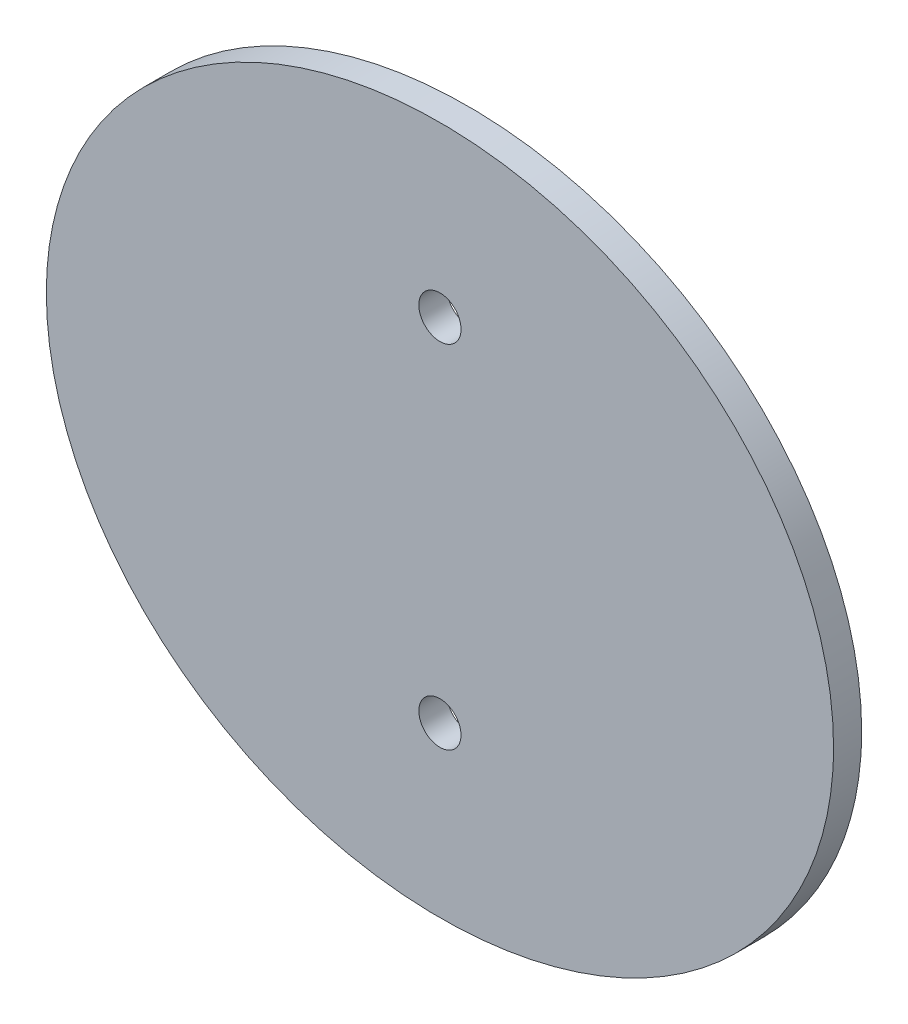
ISO-10303-21;
HEADER;
FILE_DESCRIPTION(('STEP AP214'),'2;1');
FILE_NAME('part.step','',(''),(''),'','','');
FILE_SCHEMA(('AUTOMOTIVE_DESIGN { 1 0 10303 214 1 1 1 1 }'));
ENDSEC;
DATA;
#1=APPLICATION_CONTEXT('core data for automotive mechanical design processes');
#2=APPLICATION_PROTOCOL_DEFINITION('international standard','automotive_design',2000,#1);
#3=PRODUCT_CONTEXT('',#1,'mechanical');
#4=PRODUCT('Part','Part','',(#3));
#5=PRODUCT_RELATED_PRODUCT_CATEGORY('part','',(#4));
#6=PRODUCT_DEFINITION_FORMATION('','',#4);
#7=PRODUCT_DEFINITION_CONTEXT('part definition',#1,'design');
#8=PRODUCT_DEFINITION('design','',#6,#7);
#9=PRODUCT_DEFINITION_SHAPE('','',#8);
#10=(LENGTH_UNIT() NAMED_UNIT(*) SI_UNIT(.MILLI.,.METRE.));
#11=(NAMED_UNIT(*) PLANE_ANGLE_UNIT() SI_UNIT($,.RADIAN.));
#12=(NAMED_UNIT(*) SI_UNIT($,.STERADIAN.) SOLID_ANGLE_UNIT());
#13=UNCERTAINTY_MEASURE_WITH_UNIT(LENGTH_MEASURE(1.E-05),#10,'distance_accuracy_value','');
#14=(GEOMETRIC_REPRESENTATION_CONTEXT(3) GLOBAL_UNCERTAINTY_ASSIGNED_CONTEXT((#13)) GLOBAL_UNIT_ASSIGNED_CONTEXT((#10,
#11,#12)) REPRESENTATION_CONTEXT('',''));
#15=CARTESIAN_POINT('',(0.,0.,0.));
#16=DIRECTION('',(0.,0.,1.));
#17=DIRECTION('',(1.,0.,0.));
#18=AXIS2_PLACEMENT_3D('',#15,#16,#17);
#19=CARTESIAN_POINT('',(0.,0.,2.));
#20=DIRECTION('',(0.,0.,1.));
#21=DIRECTION('',(1.,0.,0.));
#22=AXIS2_PLACEMENT_3D('',#19,#20,#21);
#23=PLANE('',#22);
#24=CARTESIAN_POINT('',(0.,-12.5,2.));
#25=DIRECTION('',(0.,0.,1.));
#26=DIRECTION('',(1.,0.,0.));
#27=AXIS2_PLACEMENT_3D('',#24,#25,#26);
#28=CIRCLE('',#27,1.5);
#29=CARTESIAN_POINT('',(1.49999999999998,-12.5,2.));
#30=VERTEX_POINT('',#29);
#31=EDGE_CURVE('E37',#30,#30,#28,.T.);
#32=ORIENTED_EDGE('',*,*,#31,.F.);
#33=EDGE_LOOP('',(#32));
#34=FACE_BOUND('',#33,.T.);
#35=CARTESIAN_POINT('',(0.,0.,2.));
#36=DIRECTION('',(0.,0.,1.));
#37=DIRECTION('',(1.,0.,0.));
#38=AXIS2_PLACEMENT_3D('',#35,#36,#37);
#39=ELLIPSE('',#38,28.,24.5);
#40=CARTESIAN_POINT('',(28.,0.,2.));
#41=VERTEX_POINT('',#40);
#42=EDGE_CURVE('E10',#41,#41,#39,.T.);
#43=ORIENTED_EDGE('',*,*,#42,.T.);
#44=EDGE_LOOP('',(#43));
#45=FACE_BOUND('',#44,.T.);
#46=CARTESIAN_POINT('',(0.,12.5,2.));
#47=DIRECTION('',(0.,0.,1.));
#48=DIRECTION('',(1.,0.,0.));
#49=AXIS2_PLACEMENT_3D('',#46,#47,#48);
#50=CIRCLE('',#49,1.5);
#51=CARTESIAN_POINT('',(1.5,12.5,2.));
#52=VERTEX_POINT('',#51);
#53=EDGE_CURVE('E43',#52,#52,#50,.T.);
#54=ORIENTED_EDGE('',*,*,#53,.F.);
#55=EDGE_LOOP('',(#54));
#56=FACE_BOUND('',#55,.T.);
#57=ADVANCED_FACE('F26',(#34,#45,#56),#23,.T.);
#58=CARTESIAN_POINT('',(0.,0.,0.));
#59=DIRECTION('',(0.,0.,1.));
#60=DIRECTION('',(1.,0.,0.));
#61=AXIS2_PLACEMENT_3D('',#58,#59,#60);
#62=PLANE('',#61);
#63=CARTESIAN_POINT('',(0.,0.,0.));
#64=DIRECTION('',(0.,0.,1.));
#65=DIRECTION('',(1.,0.,0.));
#66=AXIS2_PLACEMENT_3D('',#63,#64,#65);
#67=ELLIPSE('',#66,28.,24.5);
#68=CARTESIAN_POINT('',(28.,0.,0.));
#69=VERTEX_POINT('',#68);
#70=EDGE_CURVE('E31',#69,#69,#67,.T.);
#71=ORIENTED_EDGE('',*,*,#70,.F.);
#72=EDGE_LOOP('',(#71));
#73=FACE_BOUND('',#72,.T.);
#74=CARTESIAN_POINT('',(0.,-12.5,0.));
#75=DIRECTION('',(0.,0.,1.));
#76=DIRECTION('',(1.,0.,0.));
#77=AXIS2_PLACEMENT_3D('',#74,#75,#76);
#78=CIRCLE('',#77,1.5);
#79=CARTESIAN_POINT('',(1.49999999999998,-12.5,0.));
#80=VERTEX_POINT('',#79);
#81=EDGE_CURVE('E40',#80,#80,#78,.T.);
#82=ORIENTED_EDGE('',*,*,#81,.T.);
#83=EDGE_LOOP('',(#82));
#84=FACE_BOUND('',#83,.T.);
#85=CARTESIAN_POINT('',(0.,12.5,0.));
#86=DIRECTION('',(0.,0.,1.));
#87=DIRECTION('',(1.,0.,0.));
#88=AXIS2_PLACEMENT_3D('',#85,#86,#87);
#89=CIRCLE('',#88,1.5);
#90=CARTESIAN_POINT('',(1.5,12.5,0.));
#91=VERTEX_POINT('',#90);
#92=EDGE_CURVE('E46',#91,#91,#89,.T.);
#93=ORIENTED_EDGE('',*,*,#92,.T.);
#94=EDGE_LOOP('',(#93));
#95=FACE_BOUND('',#94,.T.);
#96=ADVANCED_FACE('F56',(#73,#84,#95),#62,.F.);
#97=DIRECTION('',(0.,0.,-1.));
#98=VECTOR('',#97,1.);
#99=SURFACE_OF_LINEAR_EXTRUSION('',#39,#98);
#100=ORIENTED_EDGE('',*,*,#42,.F.);
#101=EDGE_LOOP('',(#100));
#102=FACE_BOUND('',#101,.T.);
#103=ORIENTED_EDGE('',*,*,#70,.T.);
#104=EDGE_LOOP('',(#103));
#105=FACE_BOUND('',#104,.T.);
#106=ADVANCED_FACE('F28',(#102,#105),#99,.F.);
#107=CARTESIAN_POINT('',(0.,-12.5,2.));
#108=DIRECTION('',(0.,0.,-1.));
#109=DIRECTION('',(-1.,0.,0.));
#110=AXIS2_PLACEMENT_3D('',#107,#108,#109);
#111=CYLINDRICAL_SURFACE('',#110,1.5);
#112=ORIENTED_EDGE('',*,*,#31,.T.);
#113=EDGE_LOOP('',(#112));
#114=FACE_BOUND('',#113,.T.);
#115=ORIENTED_EDGE('',*,*,#81,.F.);
#116=EDGE_LOOP('',(#115));
#117=FACE_BOUND('',#116,.T.);
#118=ADVANCED_FACE('F65',(#114,#117),#111,.F.);
#119=CARTESIAN_POINT('',(0.,12.5,2.));
#120=DIRECTION('',(0.,0.,-1.));
#121=DIRECTION('',(-1.,0.,0.));
#122=AXIS2_PLACEMENT_3D('',#119,#120,#121);
#123=CYLINDRICAL_SURFACE('',#122,1.5);
#124=ORIENTED_EDGE('',*,*,#53,.T.);
#125=EDGE_LOOP('',(#124));
#126=FACE_BOUND('',#125,.T.);
#127=ORIENTED_EDGE('',*,*,#92,.F.);
#128=EDGE_LOOP('',(#127));
#129=FACE_BOUND('',#128,.T.);
#130=ADVANCED_FACE('F52',(#126,#129),#123,.F.);
#131=CLOSED_SHELL('',(#57,#96,#106,#118,#130));
#132=MANIFOLD_SOLID_BREP('B2',#131);
#133=ADVANCED_BREP_SHAPE_REPRESENTATION('',(#18,#132),#14);
#134=SHAPE_DEFINITION_REPRESENTATION(#9,#133);
ENDSEC;
END-ISO-10303-21;
